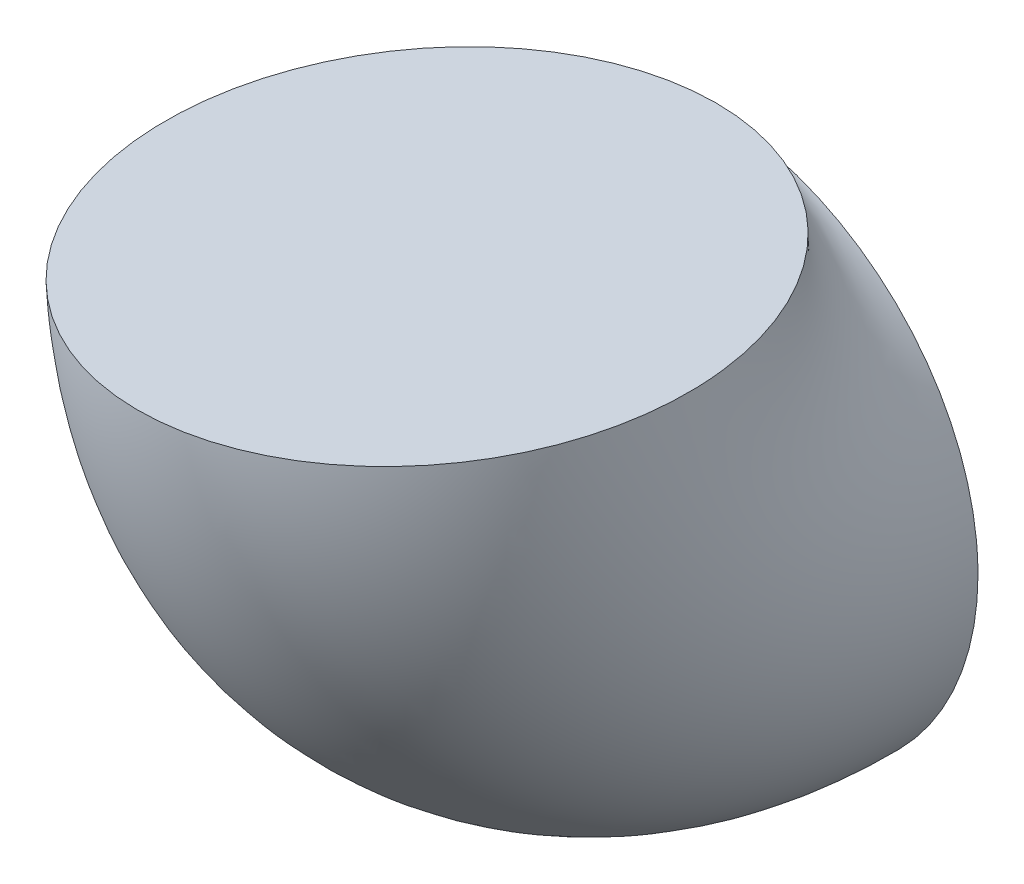
ISO-10303-21;
HEADER;
FILE_DESCRIPTION(('STEP AP214'),'2;1');
FILE_NAME('part.step','',(''),(''),'','','');
FILE_SCHEMA(('AUTOMOTIVE_DESIGN { 1 0 10303 214 1 1 1 1 }'));
ENDSEC;
DATA;
#1=APPLICATION_CONTEXT('core data for automotive mechanical design processes');
#2=APPLICATION_PROTOCOL_DEFINITION('international standard','automotive_design',2000,#1);
#3=PRODUCT_CONTEXT('',#1,'mechanical');
#4=PRODUCT('Part','Part','',(#3));
#5=PRODUCT_RELATED_PRODUCT_CATEGORY('part','',(#4));
#6=PRODUCT_DEFINITION_FORMATION('','',#4);
#7=PRODUCT_DEFINITION_CONTEXT('part definition',#1,'design');
#8=PRODUCT_DEFINITION('design','',#6,#7);
#9=PRODUCT_DEFINITION_SHAPE('','',#8);
#10=(LENGTH_UNIT() NAMED_UNIT(*) SI_UNIT(.MILLI.,.METRE.));
#11=(NAMED_UNIT(*) PLANE_ANGLE_UNIT() SI_UNIT($,.RADIAN.));
#12=(NAMED_UNIT(*) SI_UNIT($,.STERADIAN.) SOLID_ANGLE_UNIT());
#13=UNCERTAINTY_MEASURE_WITH_UNIT(LENGTH_MEASURE(1.E-05),#10,'distance_accuracy_value','');
#14=(GEOMETRIC_REPRESENTATION_CONTEXT(3) GLOBAL_UNCERTAINTY_ASSIGNED_CONTEXT((#13)) GLOBAL_UNIT_ASSIGNED_CONTEXT((#10,
#11,#12)) REPRESENTATION_CONTEXT('',''));
#15=CARTESIAN_POINT('',(0.,0.,0.));
#16=DIRECTION('',(0.,0.,1.));
#17=DIRECTION('',(1.,0.,0.));
#18=AXIS2_PLACEMENT_3D('',#15,#16,#17);
#19=CARTESIAN_POINT('',(1.725000002867,0.172869706617,0.603109542257));
#20=CARTESIAN_POINT('',(1.398561215267,0.172869706616,0.603109729117));
#21=CARTESIAN_POINT('',(1.725000002867,-0.172869718644,0.603107055151));
#22=CARTESIAN_POINT('',(1.398561215267,-0.172869718645,0.603107242011));
#23=(BOUNDED_SURFACE() B_SPLINE_SURFACE(1,1,((#19,#20),(#21,#22)),.UNSPECIFIED.,.F.,.F.,
.F.) B_SPLINE_SURFACE_WITH_KNOTS((2,2),(2,2),(-0.174989400119,0.17075002515),(-0.165431887957,
0.161006899643),.UNSPECIFIED.) GEOMETRIC_REPRESENTATION_ITEM() RATIONAL_B_SPLINE_SURFACE(((1.,
1.),(1.,1.))) REPRESENTATION_ITEM('') SURFACE());
#24=CARTESIAN_POINT('',(1.724999979026,-4.687763542621E-08,0.603108298703));
#25=CARTESIAN_POINT('',(1.724999955186,-0.06544989485239,0.603107827884));
#26=CARTESIAN_POINT('',(1.687614860516,-0.130898380807,0.603107378475));
#27=CARTESIAN_POINT('',(1.612847151848,-0.172869718644,0.60310711935));
#28=CARTESIAN_POINT('',(1.517080651937,-0.16780393854,0.603107210608));
#29=CARTESIAN_POINT('',(1.433176410981,-0.105327675533,0.603107708067));
#30=CARTESIAN_POINT('',(1.398561215267,7.206532381954E-08,0.603108485563));
#31=CARTESIAN_POINT('',(1.433176487714,0.105327794438,0.603109223435));
#32=CARTESIAN_POINT('',(1.517080774185,0.167803996302,0.603109624832));
#33=CARTESIAN_POINT('',(1.612847277786,0.172869706617,0.603109606456));
#34=CARTESIAN_POINT('',(1.687614955877,0.130898314295,0.603109261731));
#35=CARTESIAN_POINT('',(1.725000002867,0.06544980109705,0.603108769522));
#36=CARTESIAN_POINT('',(1.724999979026,-4.687763542621E-08,0.603108298703));
#37=(BOUNDED_CURVE() B_SPLINE_CURVE(12,(#24,#25,#26,#27,#28,#29,#30,#31,#32,#33,#34,#35,#36),
.UNSPECIFIED.,.T.,.F.) B_SPLINE_CURVE_WITH_KNOTS((13,13),(0.,1.),
.UNSPECIFIED.) CURVE() GEOMETRIC_REPRESENTATION_ITEM() RATIONAL_B_SPLINE_CURVE((1.,1.,1.,1.,1.,
1.,1.,1.,1.,1.,1.,1.,1.)) REPRESENTATION_ITEM(''));
#38=CARTESIAN_POINT('',(1.724999979026,-4.687763542621E-08,0.603108298703));
#39=VERTEX_POINT('',#38);
#40=EDGE_CURVE('E22',#39,#39,#37,.T.);
#41=ORIENTED_EDGE('',*,*,#40,.T.);
#42=EDGE_LOOP('',(#41));
#43=FACE_BOUND('',#42,.T.);
#44=ADVANCED_FACE('F17',(#43),#23,.T.);
#45=CARTESIAN_POINT('',(1.720071210611,0.13037829457,0.900925568112));
#46=CARTESIAN_POINT('',(1.719400224937,0.138947240902,0.555293004003));
#47=CARTESIAN_POINT('',(1.394628663536,0.104894731209,0.900925568112));
#48=CARTESIAN_POINT('',(1.393957677862,0.113463677541,0.555293004003));
#49=(BOUNDED_SURFACE() B_SPLINE_SURFACE(1,1,((#45,#46),(#47,#48)),.UNSPECIFIED.,.F.,.F.,
.F.) B_SPLINE_SURFACE_WITH_KNOTS((2,2),(2,2),(-0.165431860982,0.161006898126),(-0.170750003061,
0.174989416785),.UNSPECIFIED.) GEOMETRIC_REPRESENTATION_ITEM() RATIONAL_B_SPLINE_SURFACE(((1.,
1.),(1.,1.))) REPRESENTATION_ITEM('') SURFACE());
#50=CARTESIAN_POINT('',(1.719735717773,0.134662767736,0.728109286057));
#51=CARTESIAN_POINT('',(1.71986273803,0.133040632122,0.793538904791));
#52=CARTESIAN_POINT('',(1.682718775552,0.128500050485,0.858967175542));
#53=CARTESIAN_POINT('',(1.608260711068,0.121623047369,0.900925568112));
#54=CARTESIAN_POINT('',(1.512776635617,0.114272551318,0.895861388621));
#55=CARTESIAN_POINT('',(1.429007179305,0.109270970123,0.833404466345));
#56=CARTESIAN_POINT('',(1.394293170699,0.109179204374,0.728109286055));
#57=CARTESIAN_POINT('',(1.428598354647,0.114491940845,0.622814105772));
#58=CARTESIAN_POINT('',(1.512125312395,0.122590394677,0.56035718349));
#59=CARTESIAN_POINT('',(1.607589725394,0.130191993701,0.555293004003));
#60=CARTESIAN_POINT('',(1.682210699761,0.134988526101,0.597251396571));
#61=CARTESIAN_POINT('',(1.719608697517,0.13628490335,0.662679667323));
#62=CARTESIAN_POINT('',(1.719735717773,0.134662767736,0.728109286057));
#63=(BOUNDED_CURVE() B_SPLINE_CURVE(12,(#50,#51,#52,#53,#54,#55,#56,#57,#58,#59,#60,#61,#62),
.UNSPECIFIED.,.T.,.F.) B_SPLINE_CURVE_WITH_KNOTS((13,13),(0.,1.),
.UNSPECIFIED.) CURVE() GEOMETRIC_REPRESENTATION_ITEM() RATIONAL_B_SPLINE_CURVE((1.,1.,1.,1.,1.,
1.,1.,1.,1.,1.,1.,1.,1.)) REPRESENTATION_ITEM(''));
#64=CARTESIAN_POINT('',(1.719735717773,0.134662767736,0.728109286057));
#65=VERTEX_POINT('',#64);
#66=EDGE_CURVE('E11',#65,#65,#63,.T.);
#67=ORIENTED_EDGE('',*,*,#66,.F.);
#68=EDGE_LOOP('',(#67));
#69=FACE_BOUND('',#68,.T.);
#70=ADVANCED_FACE('F48',(#69),#49,.F.);
#71=CARTESIAN_POINT('',(1.719735717773,0.134662767736,0.728109286057));
#72=CARTESIAN_POINT('',(1.721751456326,0.09543046888304,0.730042052422));
#73=CARTESIAN_POINT('',(1.723885845413,0.0546847948625,0.716553401015));
#74=CARTESIAN_POINT('',(1.725500386753,0.02057984034431,0.686202555722));
#75=CARTESIAN_POINT('',(1.725898663412,0.002008405885197,0.64541431699));
#76=CARTESIAN_POINT('',(1.724999979026,-4.687763542621E-08,0.603108298703));
#77=CARTESIAN_POINT('',(1.71986273803,0.133040632122,0.793538904791));
#78=CARTESIAN_POINT('',(1.722438871381,0.07356030193143,0.794924589413));
#79=CARTESIAN_POINT('',(1.725115856043,0.01279483753795,0.7730723186));
#80=CARTESIAN_POINT('',(1.72693492705,-0.03701171520741,0.726577531747));
#81=CARTESIAN_POINT('',(1.7269201629,-0.06339759752576,0.66558744431));
#82=CARTESIAN_POINT('',(1.724999955186,-0.06544989485239,0.603107827884));
#83=CARTESIAN_POINT('',(1.682718775552,0.128500050485,0.858967175542));
#84=CARTESIAN_POINT('',(1.68587805044,0.04877384236327,0.85922202701));
#85=CARTESIAN_POINT('',(1.689084584801,-0.03155217056939,0.82842255366));
#86=CARTESIAN_POINT('',(1.691058123062,-0.09612840625373,0.765576247316));
#87=CARTESIAN_POINT('',(1.690579394359,-0.129385901419,0.684843225993));
#88=CARTESIAN_POINT('',(1.687614860516,-0.130898380807,0.603107378475));
#89=CARTESIAN_POINT('',(1.608260711068,0.121623047369,0.900925568112));
#90=CARTESIAN_POINT('',(1.611824868325,0.02891575107422,0.899662102485));
#91=CARTESIAN_POINT('',(1.615353287236,-0.06333082843407,0.862331774685));
#92=CARTESIAN_POINT('',(1.617357872183,-0.136112987238,0.788716951369));
#93=CARTESIAN_POINT('',(1.616512409479,-0.172496407801,0.695945952462));
#94=CARTESIAN_POINT('',(1.612847151848,-0.172869718644,0.60310711935));
#95=CARTESIAN_POINT('',(1.512776635617,0.114272551318,0.895861388621));
#96=CARTESIAN_POINT('',(1.516355717111,0.02313687769571,0.893144885902));
#97=CARTESIAN_POINT('',(1.519808749732,-0.06638484392067,0.854966530859));
#98=CARTESIAN_POINT('',(1.521669274017,-0.135565328442,0.782068641973));
#99=CARTESIAN_POINT('',(1.520725310922,-0.16892914289,0.692035744767));
#100=CARTESIAN_POINT('',(1.517080651937,-0.16780393854,0.603107210608));
#101=CARTESIAN_POINT('',(1.429007179305,0.109270970123,0.833404466345));
#102=CARTESIAN_POINT('',(1.43210240369,0.0374672856694,0.829900036122));
#103=CARTESIAN_POINT('',(1.435008238648,-0.0319144522414,0.798395174844));
#104=CARTESIAN_POINT('',(1.436561178876,-0.08401592192904,0.740441132905));
#105=CARTESIAN_POINT('',(1.435897182156,-0.107804658984,0.67072126384));
#106=CARTESIAN_POINT('',(1.433176410981,-0.105327675533,0.603107708067));
#107=CARTESIAN_POINT('',(1.394293170699,0.109179204374,0.728109286055));
#108=CARTESIAN_POINT('',(1.39650762991,0.0699620661568,0.724944756518));
#109=CARTESIAN_POINT('',(1.398528202691,0.0332227961391,0.706358872455));
#110=CARTESIAN_POINT('',(1.399705646111,0.007252310004797,0.674192595119));
#111=CARTESIAN_POINT('',(1.399659192802,-0.003087888443255,0.637407872196));
#112=CARTESIAN_POINT('',(1.398561215267,7.206532381954E-08,0.603108485563));
#113=CARTESIAN_POINT('',(1.428598354647,0.114491940845,0.622814105772));
#114=CARTESIAN_POINT('',(1.429889904411,0.107858133626,0.621070501055));
#115=CARTESIAN_POINT('',(1.431049352947,0.102911661498,0.616484604925));
#116=CARTESIAN_POINT('',(1.431943998396,0.101347017429,0.610491105324));
#117=CARTESIAN_POINT('',(1.432609405924,0.102709693819,0.605792471063));
#118=CARTESIAN_POINT('',(1.433176487714,0.105327794438,0.603109223435));
#119=CARTESIAN_POINT('',(1.512125312395,0.122590394677,0.56035718349));
#120=CARTESIAN_POINT('',(1.512830851063,0.13528078318,0.560445958089));
#121=CARTESIAN_POINT('',(1.513501610142,0.14841476988,0.565153830033));
#122=CARTESIAN_POINT('',(1.51431336531,0.159747550367,0.575037415131));
#123=CARTESIAN_POINT('',(1.515487356305,0.166453969679,0.58859376883));
#124=CARTESIAN_POINT('',(1.517080774185,0.167803996302,0.603109624832));
#125=CARTESIAN_POINT('',(1.607589725394,0.130191993701,0.555293004003));
#126=CARTESIAN_POINT('',(1.608193591961,0.144445109601,0.556919502726));
#127=CARTESIAN_POINT('',(1.608855744745,0.157953257286,0.563770071534));
#128=CARTESIAN_POINT('',(1.609779899839,0.168114935858,0.575435768333));
#129=CARTESIAN_POINT('',(1.61111632902,0.173011408147,0.589381221431));
#130=CARTESIAN_POINT('',(1.612847277786,0.172869706617,0.603109606456));
#131=CARTESIAN_POINT('',(1.682210699761,0.134988526101,0.597251396571));
#132=CARTESIAN_POINT('',(1.683128418544,0.136253609031,0.599694552469));
#133=CARTESIAN_POINT('',(1.684164592962,0.136005932694,0.602349212126));
#134=CARTESIAN_POINT('',(1.685320020983,0.134235442949,0.60407800683));
#135=CARTESIAN_POINT('',(1.6864934385,0.132235417234,0.604151547925));
#136=CARTESIAN_POINT('',(1.687614955877,0.130898314295,0.603109261731));
#137=CARTESIAN_POINT('',(1.719608697517,0.13628490335,0.662679667323));
#138=CARTESIAN_POINT('',(1.721064041271,0.117300635835,0.665159515431));
#139=CARTESIAN_POINT('',(1.722655834783,0.09657475218705,0.660034483429));
#140=CARTESIAN_POINT('',(1.724065846456,0.078171395896,0.645827579698));
#141=CARTESIAN_POINT('',(1.724877163925,0.0674144092961,0.625241189669));
#142=CARTESIAN_POINT('',(1.725000002867,0.06544980109705,0.603108769522));
#143=CARTESIAN_POINT('',(1.719735717773,0.134662767736,0.728109286057));
#144=CARTESIAN_POINT('',(1.721751456326,0.09543046888304,0.730042052422));
#145=CARTESIAN_POINT('',(1.723885845413,0.0546847948625,0.716553401015));
#146=CARTESIAN_POINT('',(1.725500386753,0.02057984034431,0.686202555722));
#147=CARTESIAN_POINT('',(1.725898663412,0.002008405885197,0.64541431699));
#148=CARTESIAN_POINT('',(1.724999979026,-4.687763542621E-08,0.603108298703));
#149=(BOUNDED_SURFACE() B_SPLINE_SURFACE(12,5,((#71,#72,#73,#74,#75,#76),(#77,#78,#79,#80,#81,
#82),(#83,#84,#85,#86,#87,#88),(#89,#90,#91,#92,#93,#94),(#95,#96,#97,#98,#99,#100),(#101,#102,
#103,#104,#105,#106),(#107,#108,#109,#110,#111,#112),(#113,#114,#115,#116,#117,#118),(#119,#120,
#121,#122,#123,#124),(#125,#126,#127,#128,#129,#130),(#131,#132,#133,#134,#135,#136),(#137,#138,
#139,#140,#141,#142),(#143,#144,#145,#146,#147,#148)),.UNSPECIFIED.,.T.,.F.,
.F.) B_SPLINE_SURFACE_WITH_KNOTS((13,13),(6,6),(0.,1.),(1.570796326795,3.14159265359),
.UNSPECIFIED.) GEOMETRIC_REPRESENTATION_ITEM() RATIONAL_B_SPLINE_SURFACE(((1.,1.,1.,1.,1.,1.),
(1.,1.,1.,1.,1.,1.),(1.,1.,1.,1.,1.,1.),(1.,1.,1.,1.,1.,1.),(1.,1.,1.,1.,1.,1.),(1.,1.,1.,1.,1.,
1.),(1.,1.,1.,1.,1.,1.),(1.,1.,1.,1.,1.,1.),(1.,1.,1.,1.,1.,1.),(1.,1.,1.,1.,1.,1.),(1.,1.,1.,
1.,1.,1.),(1.,1.,1.,1.,1.,1.),(1.,1.,1.,1.,1.,1.))) REPRESENTATION_ITEM('') SURFACE());
#150=CARTESIAN_POINT('',(1.719735717773,0.134662767736,0.728109286057));
#151=CARTESIAN_POINT('',(1.721751456326,0.09543046888304,0.730042052422));
#152=CARTESIAN_POINT('',(1.723885845413,0.0546847948625,0.716553401015));
#153=CARTESIAN_POINT('',(1.725500386753,0.02057984034431,0.686202555722));
#154=CARTESIAN_POINT('',(1.725898663412,0.002008405885197,0.64541431699));
#155=CARTESIAN_POINT('',(1.724999979026,-4.687763542621E-08,0.603108298703));
#156=(BOUNDED_CURVE() B_SPLINE_CURVE(5,(#150,#151,#152,#153,#154,#155),.UNSPECIFIED.,.F.,
.F.) B_SPLINE_CURVE_WITH_KNOTS((6,6),(1.570796326795,3.14159265359),
.UNSPECIFIED.) CURVE() GEOMETRIC_REPRESENTATION_ITEM() RATIONAL_B_SPLINE_CURVE((1.,1.,1.,1.,1.,1.)) REPRESENTATION_ITEM(''));
#157=EDGE_CURVE('E46',#65,#39,#156,.T.);
#158=ORIENTED_EDGE('',*,*,#157,.T.);
#159=ORIENTED_EDGE('',*,*,#40,.F.);
#160=ORIENTED_EDGE('',*,*,#157,.F.);
#161=ORIENTED_EDGE('',*,*,#66,.T.);
#162=EDGE_LOOP('',(#158,#159,#160,#161));
#163=FACE_BOUND('',#162,.T.);
#164=ADVANCED_FACE('F45',(#163),#149,.T.);
#165=CLOSED_SHELL('',(#44,#70,#164));
#166=MANIFOLD_SOLID_BREP('B1',#165);
#167=ADVANCED_BREP_SHAPE_REPRESENTATION('',(#18,#166),#14);
#168=SHAPE_DEFINITION_REPRESENTATION(#9,#167);
ENDSEC;
END-ISO-10303-21;
